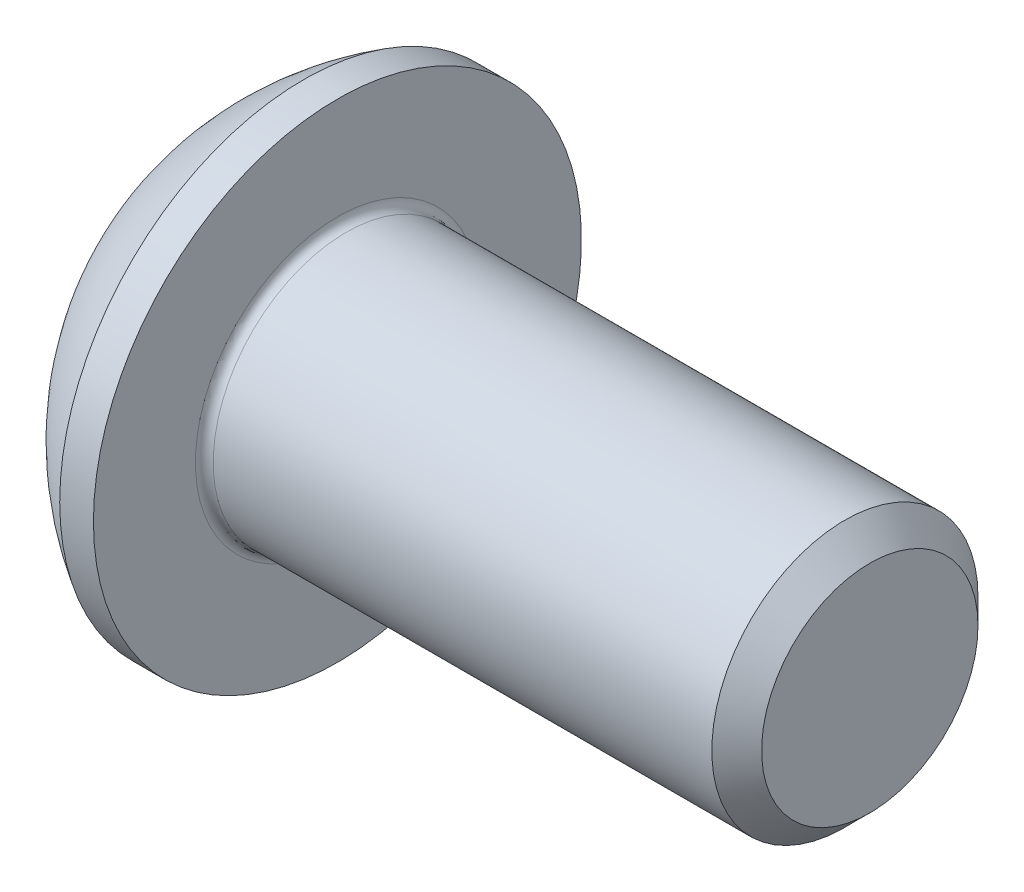
ISO-10303-21;
HEADER;
FILE_DESCRIPTION(('STEP AP214'),'2;1');
FILE_NAME('part.step','',(''),(''),'','','');
FILE_SCHEMA(('AUTOMOTIVE_DESIGN { 1 0 10303 214 1 1 1 1 }'));
ENDSEC;
DATA;
#1=APPLICATION_CONTEXT('core data for automotive mechanical design processes');
#2=APPLICATION_PROTOCOL_DEFINITION('international standard','automotive_design',2000,#1);
#3=PRODUCT_CONTEXT('',#1,'mechanical');
#4=PRODUCT('Part','Part','',(#3));
#5=PRODUCT_RELATED_PRODUCT_CATEGORY('part','',(#4));
#6=PRODUCT_DEFINITION_FORMATION('','',#4);
#7=PRODUCT_DEFINITION_CONTEXT('part definition',#1,'design');
#8=PRODUCT_DEFINITION('design','',#6,#7);
#9=PRODUCT_DEFINITION_SHAPE('','',#8);
#10=(LENGTH_UNIT() NAMED_UNIT(*) SI_UNIT(.MILLI.,.METRE.));
#11=(NAMED_UNIT(*) PLANE_ANGLE_UNIT() SI_UNIT($,.RADIAN.));
#12=(NAMED_UNIT(*) SI_UNIT($,.STERADIAN.) SOLID_ANGLE_UNIT());
#13=UNCERTAINTY_MEASURE_WITH_UNIT(LENGTH_MEASURE(1.E-05),#10,'distance_accuracy_value','');
#14=(GEOMETRIC_REPRESENTATION_CONTEXT(3) GLOBAL_UNCERTAINTY_ASSIGNED_CONTEXT((#13)) GLOBAL_UNIT_ASSIGNED_CONTEXT((#10,
#11,#12)) REPRESENTATION_CONTEXT('',''));
#15=CARTESIAN_POINT('',(0.,0.,0.));
#16=DIRECTION('',(0.,0.,1.));
#17=DIRECTION('',(1.,0.,0.));
#18=AXIS2_PLACEMENT_3D('',#15,#16,#17);
#19=CARTESIAN_POINT('',(1.04,0.,0.));
#20=DIRECTION('',(-1.,0.,0.));
#21=DIRECTION('',(0.,0.,1.));
#22=AXIS2_PLACEMENT_3D('',#19,#20,#21);
#23=PLANE('',#22);
#24=DIRECTION('',(0.,-1.,0.));
#25=VECTOR('',#24,1.);
#26=CARTESIAN_POINT('',(1.04,0.577350269189628,-1.));
#27=LINE('',#26,#25);
#28=CARTESIAN_POINT('',(1.04,0.577350269189628,-1.));
#29=VERTEX_POINT('',#28);
#30=CARTESIAN_POINT('',(1.04,0.,-1.));
#31=VERTEX_POINT('',#30);
#32=EDGE_CURVE('E254',#29,#31,#27,.T.);
#33=ORIENTED_EDGE('',*,*,#32,.T.);
#34=CARTESIAN_POINT('',(1.04,0.,0.));
#35=DIRECTION('',(1.,0.,0.));
#36=DIRECTION('',(0.,0.,-1.));
#37=AXIS2_PLACEMENT_3D('',#34,#35,#36);
#38=CIRCLE('',#37,0.999999999983859);
#39=CARTESIAN_POINT('',(1.04,0.866025403770461,-0.499999999991928));
#40=VERTEX_POINT('',#39);
#41=EDGE_CURVE('E50',#31,#40,#38,.T.);
#42=ORIENTED_EDGE('',*,*,#41,.T.);
#43=DIRECTION('',(0.,-0.499999999999999,-0.866025403784439));
#44=VECTOR('',#43,1.);
#45=CARTESIAN_POINT('',(1.04,1.15470053837925,0.));
#46=LINE('',#45,#44);
#47=EDGE_CURVE('E225',#40,#29,#46,.T.);
#48=ORIENTED_EDGE('',*,*,#47,.T.);
#49=EDGE_LOOP('',(#33,#42,#48));
#50=FACE_BOUND('',#49,.T.);
#51=ADVANCED_FACE('F35',(#50),#23,.T.);
#52=CARTESIAN_POINT('',(1.04,1.15470053837925,0.));
#53=VERTEX_POINT('',#52);
#54=EDGE_CURVE('E257',#53,#40,#46,.T.);
#55=ORIENTED_EDGE('',*,*,#54,.T.);
#56=CARTESIAN_POINT('',(1.04,0.866025403770461,0.499999999991928));
#57=VERTEX_POINT('',#56);
#58=EDGE_CURVE('E189',#40,#57,#38,.T.);
#59=ORIENTED_EDGE('',*,*,#58,.T.);
#60=DIRECTION('',(0.,0.499999999999999,-0.866025403784439));
#61=VECTOR('',#60,1.);
#62=CARTESIAN_POINT('',(1.04,0.577350269189628,1.));
#63=LINE('',#62,#61);
#64=EDGE_CURVE('E241',#57,#53,#63,.T.);
#65=ORIENTED_EDGE('',*,*,#64,.T.);
#66=EDGE_LOOP('',(#55,#59,#65));
#67=FACE_BOUND('',#66,.T.);
#68=ADVANCED_FACE('F125',(#67),#23,.T.);
#69=CARTESIAN_POINT('',(1.04,0.577350269189628,1.));
#70=VERTEX_POINT('',#69);
#71=EDGE_CURVE('E213',#70,#57,#63,.T.);
#72=ORIENTED_EDGE('',*,*,#71,.T.);
#73=CARTESIAN_POINT('',(1.04,0.,0.999999999983859));
#74=VERTEX_POINT('',#73);
#75=EDGE_CURVE('E193',#57,#74,#38,.T.);
#76=ORIENTED_EDGE('',*,*,#75,.T.);
#77=DIRECTION('',(0.,1.,0.));
#78=VECTOR('',#77,1.);
#79=CARTESIAN_POINT('',(1.04,-0.577350269189625,1.));
#80=LINE('',#79,#78);
#81=EDGE_CURVE('E245',#74,#70,#80,.T.);
#82=ORIENTED_EDGE('',*,*,#81,.T.);
#83=EDGE_LOOP('',(#72,#76,#82));
#84=FACE_BOUND('',#83,.T.);
#85=ADVANCED_FACE('F130',(#84),#23,.T.);
#86=CARTESIAN_POINT('',(1.04,-0.577350269189625,1.));
#87=VERTEX_POINT('',#86);
#88=EDGE_CURVE('E242',#87,#74,#80,.T.);
#89=ORIENTED_EDGE('',*,*,#88,.T.);
#90=CARTESIAN_POINT('',(1.04,-0.866025403770461,0.499999999991928));
#91=VERTEX_POINT('',#90);
#92=EDGE_CURVE('E263',#74,#91,#38,.T.);
#93=ORIENTED_EDGE('',*,*,#92,.T.);
#94=DIRECTION('',(0.,0.499999999999998,0.86602540378444));
#95=VECTOR('',#94,1.);
#96=CARTESIAN_POINT('',(1.04,-1.15470053837925,0.));
#97=LINE('',#96,#95);
#98=EDGE_CURVE('E249',#91,#87,#97,.T.);
#99=ORIENTED_EDGE('',*,*,#98,.T.);
#100=EDGE_LOOP('',(#89,#93,#99));
#101=FACE_BOUND('',#100,.T.);
#102=ADVANCED_FACE('F275',(#101),#23,.T.);
#103=CARTESIAN_POINT('',(1.04,-1.15470053837925,0.));
#104=VERTEX_POINT('',#103);
#105=EDGE_CURVE('E246',#104,#91,#97,.T.);
#106=ORIENTED_EDGE('',*,*,#105,.T.);
#107=CARTESIAN_POINT('',(1.04,-0.866025403770461,-0.499999999991927));
#108=VERTEX_POINT('',#107);
#109=EDGE_CURVE('E260',#91,#108,#38,.T.);
#110=ORIENTED_EDGE('',*,*,#109,.T.);
#111=DIRECTION('',(0.,-0.499999999999998,0.86602540378444));
#112=VECTOR('',#111,1.);
#113=CARTESIAN_POINT('',(1.04,-0.577350269189626,-1.));
#114=LINE('',#113,#112);
#115=EDGE_CURVE('E253',#108,#104,#114,.T.);
#116=ORIENTED_EDGE('',*,*,#115,.T.);
#117=EDGE_LOOP('',(#106,#110,#116));
#118=FACE_BOUND('',#117,.T.);
#119=ADVANCED_FACE('F123',(#118),#23,.T.);
#120=CARTESIAN_POINT('',(1.65,0.,0.));
#121=DIRECTION('',(-1.,0.,0.));
#122=DIRECTION('',(0.,0.,1.));
#123=AXIS2_PLACEMENT_3D('',#120,#121,#122);
#124=CYLINDRICAL_SURFACE('',#123,2.75);
#125=CARTESIAN_POINT('',(1.65,0.,0.));
#126=DIRECTION('',(-1.,0.,0.));
#127=DIRECTION('',(0.,0.,1.));
#128=AXIS2_PLACEMENT_3D('',#125,#126,#127);
#129=CIRCLE('',#128,2.75);
#130=CARTESIAN_POINT('',(1.65,0.,2.75));
#131=VERTEX_POINT('',#130);
#132=EDGE_CURVE('E196',#131,#131,#129,.T.);
#133=ORIENTED_EDGE('',*,*,#132,.T.);
#134=EDGE_LOOP('',(#133));
#135=FACE_BOUND('',#134,.T.);
#136=CARTESIAN_POINT('',(1.27,0.,0.));
#137=DIRECTION('',(-1.,0.,0.));
#138=DIRECTION('',(0.,0.,1.));
#139=AXIS2_PLACEMENT_3D('',#136,#137,#138);
#140=CIRCLE('',#139,2.75);
#141=CARTESIAN_POINT('',(1.27,0.,2.75));
#142=VERTEX_POINT('',#141);
#143=EDGE_CURVE('E206',#142,#142,#140,.T.);
#144=ORIENTED_EDGE('',*,*,#143,.F.);
#145=EDGE_LOOP('',(#144));
#146=FACE_BOUND('',#145,.T.);
#147=ADVANCED_FACE('F167',(#135,#146),#124,.T.);
#148=CARTESIAN_POINT('',(1.65,2.75,0.));
#149=DIRECTION('',(1.,0.,0.));
#150=DIRECTION('',(0.,0.,-1.));
#151=AXIS2_PLACEMENT_3D('',#148,#149,#150);
#152=PLANE('',#151);
#153=CARTESIAN_POINT('',(1.65,0.,0.));
#154=DIRECTION('',(1.,0.,0.));
#155=DIRECTION('',(0.,0.,-1.));
#156=AXIS2_PLACEMENT_3D('',#153,#154,#155);
#157=CIRCLE('',#156,1.6);
#158=CARTESIAN_POINT('',(1.65,0.,-1.6));
#159=VERTEX_POINT('',#158);
#160=EDGE_CURVE('E184',#159,#159,#157,.F.);
#161=ORIENTED_EDGE('',*,*,#160,.T.);
#162=EDGE_LOOP('',(#161));
#163=FACE_BOUND('',#162,.T.);
#164=ORIENTED_EDGE('',*,*,#132,.F.);
#165=EDGE_LOOP('',(#164));
#166=FACE_BOUND('',#165,.T.);
#167=ADVANCED_FACE('F163',(#163,#166),#152,.T.);
#168=CARTESIAN_POINT('',(0.,0.,0.));
#169=DIRECTION('',(-1.,0.,0.));
#170=DIRECTION('',(0.,0.,1.));
#171=AXIS2_PLACEMENT_3D('',#168,#169,#170);
#172=PLANE('',#171);
#173=DIRECTION('',(0.,-0.499999999999999,-0.866025403784439));
#174=VECTOR('',#173,1.);
#175=CARTESIAN_POINT('',(0.,1.15470053837925,0.));
#176=LINE('',#175,#174);
#177=CARTESIAN_POINT('',(0.,1.15470053837925,0.));
#178=VERTEX_POINT('',#177);
#179=CARTESIAN_POINT('',(0.,0.577350269189628,-1.));
#180=VERTEX_POINT('',#179);
#181=EDGE_CURVE('E58',#178,#180,#176,.T.);
#182=ORIENTED_EDGE('',*,*,#181,.F.);
#183=DIRECTION('',(0.,0.499999999999999,-0.866025403784439));
#184=VECTOR('',#183,1.);
#185=CARTESIAN_POINT('',(0.,0.577350269189628,1.));
#186=LINE('',#185,#184);
#187=CARTESIAN_POINT('',(0.,0.577350269189628,1.));
#188=VERTEX_POINT('',#187);
#189=EDGE_CURVE('E222',#188,#178,#186,.T.);
#190=ORIENTED_EDGE('',*,*,#189,.F.);
#191=DIRECTION('',(0.,1.,0.));
#192=VECTOR('',#191,1.);
#193=CARTESIAN_POINT('',(0.,-0.577350269189625,1.));
#194=LINE('',#193,#192);
#195=CARTESIAN_POINT('',(0.,-0.577350269189625,1.));
#196=VERTEX_POINT('',#195);
#197=EDGE_CURVE('E226',#196,#188,#194,.T.);
#198=ORIENTED_EDGE('',*,*,#197,.F.);
#199=DIRECTION('',(0.,0.499999999999998,0.86602540378444));
#200=VECTOR('',#199,1.);
#201=CARTESIAN_POINT('',(0.,-1.15470053837925,0.));
#202=LINE('',#201,#200);
#203=CARTESIAN_POINT('',(0.,-1.15470053837925,0.));
#204=VERTEX_POINT('',#203);
#205=EDGE_CURVE('E229',#204,#196,#202,.T.);
#206=ORIENTED_EDGE('',*,*,#205,.F.);
#207=DIRECTION('',(0.,-0.499999999999998,0.86602540378444));
#208=VECTOR('',#207,1.);
#209=CARTESIAN_POINT('',(0.,-0.577350269189626,-1.));
#210=LINE('',#209,#208);
#211=CARTESIAN_POINT('',(0.,-0.577350269189626,-1.));
#212=VERTEX_POINT('',#211);
#213=EDGE_CURVE('E232',#212,#204,#210,.T.);
#214=ORIENTED_EDGE('',*,*,#213,.F.);
#215=DIRECTION('',(0.,-1.,0.));
#216=VECTOR('',#215,1.);
#217=CARTESIAN_POINT('',(0.,0.577350269189628,-1.));
#218=LINE('',#217,#216);
#219=EDGE_CURVE('E235',#180,#212,#218,.T.);
#220=ORIENTED_EDGE('',*,*,#219,.F.);
#221=EDGE_LOOP('',(#182,#190,#198,#206,#214,#220));
#222=FACE_BOUND('',#221,.T.);
#223=CARTESIAN_POINT('',(0.,0.,0.));
#224=DIRECTION('',(-1.,0.,0.));
#225=DIRECTION('',(0.,0.,1.));
#226=AXIS2_PLACEMENT_3D('',#223,#224,#225);
#227=CIRCLE('',#226,1.425);
#228=CARTESIAN_POINT('',(0.,0.,1.425));
#229=VERTEX_POINT('',#228);
#230=EDGE_CURVE('E203',#229,#229,#227,.T.);
#231=ORIENTED_EDGE('',*,*,#230,.T.);
#232=EDGE_LOOP('',(#231));
#233=FACE_BOUND('',#232,.T.);
#234=ADVANCED_FACE('F159',(#222,#233),#172,.T.);
#235=CARTESIAN_POINT('',(2.96202427690375,0.,0.));
#236=DIRECTION('',(-1.,0.,0.));
#237=DIRECTION('',(0.,0.,1.));
#238=AXIS2_PLACEMENT_3D('',#235,#236,#237);
#239=DEGENERATE_TOROIDAL_SURFACE('',#238,0.14293081635303,3.35141684393879,.F.);
#240=ORIENTED_EDGE('',*,*,#143,.T.);
#241=EDGE_LOOP('',(#240));
#242=FACE_BOUND('',#241,.T.);
#243=ORIENTED_EDGE('',*,*,#230,.F.);
#244=EDGE_LOOP('',(#243));
#245=FACE_BOUND('',#244,.T.);
#246=ADVANCED_FACE('F156',(#242,#245),#239,.F.);
#247=CARTESIAN_POINT('',(1.04,1.15470053837925,0.));
#248=DIRECTION('',(0.,0.866025403784439,-0.499999999999999));
#249=DIRECTION('',(0.,0.499999999999999,0.866025403784439));
#250=AXIS2_PLACEMENT_3D('',#247,#248,#249);
#251=PLANE('',#250);
#252=ORIENTED_EDGE('',*,*,#181,.T.);
#253=DIRECTION('',(-1.,0.,0.));
#254=VECTOR('',#253,1.);
#255=CARTESIAN_POINT('',(1.04,0.577350269189628,-1.));
#256=LINE('',#255,#254);
#257=EDGE_CURVE('E210',#29,#180,#256,.T.);
#258=ORIENTED_EDGE('',*,*,#257,.F.);
#259=ORIENTED_EDGE('',*,*,#47,.F.);
#260=ORIENTED_EDGE('',*,*,#54,.F.);
#261=DIRECTION('',(-1.,0.,0.));
#262=VECTOR('',#261,1.);
#263=CARTESIAN_POINT('',(1.04,1.15470053837925,0.));
#264=LINE('',#263,#262);
#265=EDGE_CURVE('E209',#53,#178,#264,.T.);
#266=ORIENTED_EDGE('',*,*,#265,.T.);
#267=EDGE_LOOP('',(#252,#258,#259,#260,#266));
#268=FACE_BOUND('',#267,.T.);
#269=ADVANCED_FACE('F138',(#268),#251,.F.);
#270=CARTESIAN_POINT('',(1.04,0.577350269189628,1.));
#271=DIRECTION('',(0.,0.866025403784439,0.499999999999999));
#272=DIRECTION('',(0.,-0.499999999999999,0.866025403784439));
#273=AXIS2_PLACEMENT_3D('',#270,#271,#272);
#274=PLANE('',#273);
#275=ORIENTED_EDGE('',*,*,#189,.T.);
#276=ORIENTED_EDGE('',*,*,#265,.F.);
#277=ORIENTED_EDGE('',*,*,#64,.F.);
#278=ORIENTED_EDGE('',*,*,#71,.F.);
#279=DIRECTION('',(-1.,0.,0.));
#280=VECTOR('',#279,1.);
#281=CARTESIAN_POINT('',(1.04,0.577350269189628,1.));
#282=LINE('',#281,#280);
#283=EDGE_CURVE('E219',#70,#188,#282,.T.);
#284=ORIENTED_EDGE('',*,*,#283,.T.);
#285=EDGE_LOOP('',(#275,#276,#277,#278,#284));
#286=FACE_BOUND('',#285,.T.);
#287=ADVANCED_FACE('F134',(#286),#274,.F.);
#288=CARTESIAN_POINT('',(1.04,-0.577350269189625,1.));
#289=DIRECTION('',(0.,0.,1.));
#290=DIRECTION('',(1.,0.,0.));
#291=AXIS2_PLACEMENT_3D('',#288,#289,#290);
#292=PLANE('',#291);
#293=ORIENTED_EDGE('',*,*,#197,.T.);
#294=ORIENTED_EDGE('',*,*,#283,.F.);
#295=ORIENTED_EDGE('',*,*,#81,.F.);
#296=ORIENTED_EDGE('',*,*,#88,.F.);
#297=DIRECTION('',(-1.,0.,0.));
#298=VECTOR('',#297,1.);
#299=CARTESIAN_POINT('',(1.04,-0.577350269189625,1.));
#300=LINE('',#299,#298);
#301=EDGE_CURVE('E217',#87,#196,#300,.T.);
#302=ORIENTED_EDGE('',*,*,#301,.T.);
#303=EDGE_LOOP('',(#293,#294,#295,#296,#302));
#304=FACE_BOUND('',#303,.T.);
#305=ADVANCED_FACE('F137',(#304),#292,.F.);
#306=CARTESIAN_POINT('',(1.04,-1.15470053837925,0.));
#307=DIRECTION('',(0.,-0.86602540378444,0.499999999999998));
#308=DIRECTION('',(0.,-0.499999999999998,-0.86602540378444));
#309=AXIS2_PLACEMENT_3D('',#306,#307,#308);
#310=PLANE('',#309);
#311=ORIENTED_EDGE('',*,*,#205,.T.);
#312=ORIENTED_EDGE('',*,*,#301,.F.);
#313=ORIENTED_EDGE('',*,*,#98,.F.);
#314=ORIENTED_EDGE('',*,*,#105,.F.);
#315=DIRECTION('',(-1.,0.,0.));
#316=VECTOR('',#315,1.);
#317=CARTESIAN_POINT('',(1.04,-1.15470053837925,0.));
#318=LINE('',#317,#316);
#319=EDGE_CURVE('E215',#104,#204,#318,.T.);
#320=ORIENTED_EDGE('',*,*,#319,.T.);
#321=EDGE_LOOP('',(#311,#312,#313,#314,#320));
#322=FACE_BOUND('',#321,.T.);
#323=ADVANCED_FACE('F142',(#322),#310,.F.);
#324=CARTESIAN_POINT('',(1.04,-0.577350269189626,-1.));
#325=DIRECTION('',(0.,-0.86602540378444,-0.499999999999998));
#326=DIRECTION('',(0.,0.499999999999998,-0.86602540378444));
#327=AXIS2_PLACEMENT_3D('',#324,#325,#326);
#328=PLANE('',#327);
#329=ORIENTED_EDGE('',*,*,#213,.T.);
#330=ORIENTED_EDGE('',*,*,#319,.F.);
#331=ORIENTED_EDGE('',*,*,#115,.F.);
#332=CARTESIAN_POINT('',(1.04,-0.577350269189626,-1.));
#333=VERTEX_POINT('',#332);
#334=EDGE_CURVE('E250',#333,#108,#114,.T.);
#335=ORIENTED_EDGE('',*,*,#334,.F.);
#336=DIRECTION('',(-1.,0.,0.));
#337=VECTOR('',#336,1.);
#338=CARTESIAN_POINT('',(1.04,-0.577350269189626,-1.));
#339=LINE('',#338,#337);
#340=EDGE_CURVE('E212',#333,#212,#339,.T.);
#341=ORIENTED_EDGE('',*,*,#340,.T.);
#342=EDGE_LOOP('',(#329,#330,#331,#335,#341));
#343=FACE_BOUND('',#342,.T.);
#344=ADVANCED_FACE('F146',(#343),#328,.F.);
#345=CARTESIAN_POINT('',(1.04,0.577350269189628,-1.));
#346=DIRECTION('',(0.,0.,-1.));
#347=DIRECTION('',(-1.,0.,0.));
#348=AXIS2_PLACEMENT_3D('',#345,#346,#347);
#349=PLANE('',#348);
#350=ORIENTED_EDGE('',*,*,#219,.T.);
#351=ORIENTED_EDGE('',*,*,#340,.F.);
#352=EDGE_CURVE('E256',#31,#333,#27,.T.);
#353=ORIENTED_EDGE('',*,*,#352,.F.);
#354=ORIENTED_EDGE('',*,*,#32,.F.);
#355=ORIENTED_EDGE('',*,*,#257,.T.);
#356=EDGE_LOOP('',(#350,#351,#353,#354,#355));
#357=FACE_BOUND('',#356,.T.);
#358=ADVANCED_FACE('F120',(#357),#349,.F.);
#359=ORIENTED_EDGE('',*,*,#334,.T.);
#360=EDGE_CURVE('E202',#108,#31,#38,.T.);
#361=ORIENTED_EDGE('',*,*,#360,.T.);
#362=ORIENTED_EDGE('',*,*,#352,.T.);
#363=EDGE_LOOP('',(#359,#361,#362));
#364=FACE_BOUND('',#363,.T.);
#365=ADVANCED_FACE('F111',(#364),#23,.T.);
#366=CARTESIAN_POINT('',(1.61735026918031,0.,0.));
#367=DIRECTION('',(-1.,0.,0.));
#368=DIRECTION('',(0.,0.,1.));
#369=AXIS2_PLACEMENT_3D('',#366,#367,#368);
#370=CONICAL_SURFACE('',#369,0.,1.0471975511966);
#371=ORIENTED_EDGE('',*,*,#41,.F.);
#372=ORIENTED_EDGE('',*,*,#360,.F.);
#373=ORIENTED_EDGE('',*,*,#109,.F.);
#374=ORIENTED_EDGE('',*,*,#92,.F.);
#375=ORIENTED_EDGE('',*,*,#75,.F.);
#376=ORIENTED_EDGE('',*,*,#58,.F.);
#377=EDGE_LOOP('',(#371,#372,#373,#374,#375,#376));
#378=FACE_BOUND('',#377,.T.);
#379=CARTESIAN_POINT('',(1.61735026918031,0.,0.));
#380=VERTEX_POINT('',#379);
#381=VERTEX_LOOP('',#380);
#382=FACE_BOUND('',#381,.T.);
#383=ADVANCED_FACE('F108',(#378,#382),#370,.F.);
#384=CARTESIAN_POINT('',(7.65,0.,0.));
#385=DIRECTION('',(-1.,0.,0.));
#386=DIRECTION('',(0.,0.,1.));
#387=AXIS2_PLACEMENT_3D('',#384,#385,#386);
#388=CYLINDRICAL_SURFACE('',#387,1.5);
#389=CARTESIAN_POINT('',(7.3695,0.,0.));
#390=DIRECTION('',(1.,0.,0.));
#391=DIRECTION('',(0.,0.,-1.));
#392=AXIS2_PLACEMENT_3D('',#389,#390,#391);
#393=CIRCLE('',#392,1.5);
#394=CARTESIAN_POINT('',(7.3695,0.,-1.5));
#395=VERTEX_POINT('',#394);
#396=EDGE_CURVE('E11',#395,#395,#393,.F.);
#397=ORIENTED_EDGE('',*,*,#396,.T.);
#398=EDGE_LOOP('',(#397));
#399=FACE_BOUND('',#398,.T.);
#400=CARTESIAN_POINT('',(1.75,0.,0.));
#401=DIRECTION('',(1.,0.,0.));
#402=DIRECTION('',(0.,0.,-1.));
#403=AXIS2_PLACEMENT_3D('',#400,#401,#402);
#404=CIRCLE('',#403,1.5);
#405=CARTESIAN_POINT('',(1.75,0.,-1.5));
#406=VERTEX_POINT('',#405);
#407=EDGE_CURVE('E187',#406,#406,#404,.T.);
#408=ORIENTED_EDGE('',*,*,#407,.T.);
#409=EDGE_LOOP('',(#408));
#410=FACE_BOUND('',#409,.T.);
#411=ADVANCED_FACE('F110',(#399,#410),#388,.T.);
#412=CARTESIAN_POINT('',(7.65,0.,0.));
#413=DIRECTION('',(1.,0.,0.));
#414=DIRECTION('',(0.,0.,-1.));
#415=AXIS2_PLACEMENT_3D('',#412,#413,#414);
#416=PLANE('',#415);
#417=CARTESIAN_POINT('',(7.65,0.,0.));
#418=DIRECTION('',(1.,0.,0.));
#419=DIRECTION('',(0.,0.,-1.));
#420=AXIS2_PLACEMENT_3D('',#417,#418,#419);
#421=CIRCLE('',#420,1.2195);
#422=CARTESIAN_POINT('',(7.65,0.,-1.2195));
#423=VERTEX_POINT('',#422);
#424=EDGE_CURVE('E43',#423,#423,#421,.T.);
#425=ORIENTED_EDGE('',*,*,#424,.T.);
#426=EDGE_LOOP('',(#425));
#427=FACE_BOUND('',#426,.T.);
#428=ADVANCED_FACE('F117',(#427),#416,.T.);
#429=CARTESIAN_POINT('',(1.75,0.,0.));
#430=DIRECTION('',(1.,0.,0.));
#431=DIRECTION('',(0.,0.,-1.));
#432=AXIS2_PLACEMENT_3D('',#429,#430,#431);
#433=TOROIDAL_SURFACE('',#432,1.6,0.1);
#434=ORIENTED_EDGE('',*,*,#160,.F.);
#435=EDGE_LOOP('',(#434));
#436=FACE_BOUND('',#435,.T.);
#437=ORIENTED_EDGE('',*,*,#407,.F.);
#438=EDGE_LOOP('',(#437));
#439=FACE_BOUND('',#438,.T.);
#440=ADVANCED_FACE('F171',(#436,#439),#433,.F.);
#441=CARTESIAN_POINT('',(7.65,0.,0.));
#442=DIRECTION('',(-1.,0.,0.));
#443=DIRECTION('',(0.,0.,1.));
#444=AXIS2_PLACEMENT_3D('',#441,#442,#443);
#445=CONICAL_SURFACE('',#444,1.2195,0.785398163397446);
#446=ORIENTED_EDGE('',*,*,#396,.F.);
#447=EDGE_LOOP('',(#446));
#448=FACE_BOUND('',#447,.T.);
#449=ORIENTED_EDGE('',*,*,#424,.F.);
#450=EDGE_LOOP('',(#449));
#451=FACE_BOUND('',#450,.T.);
#452=ADVANCED_FACE('F37',(#448,#451),#445,.T.);
#453=CLOSED_SHELL('',(#51,#68,#85,#102,#119,#147,#167,#234,#246,#269,#287,#305,#323,#344,#358,
#365,#383,#411,#428,#440,#452));
#454=MANIFOLD_SOLID_BREP('B2',#453);
#455=ADVANCED_BREP_SHAPE_REPRESENTATION('',(#18,#454),#14);
#456=SHAPE_DEFINITION_REPRESENTATION(#9,#455);
ENDSEC;
END-ISO-10303-21;
